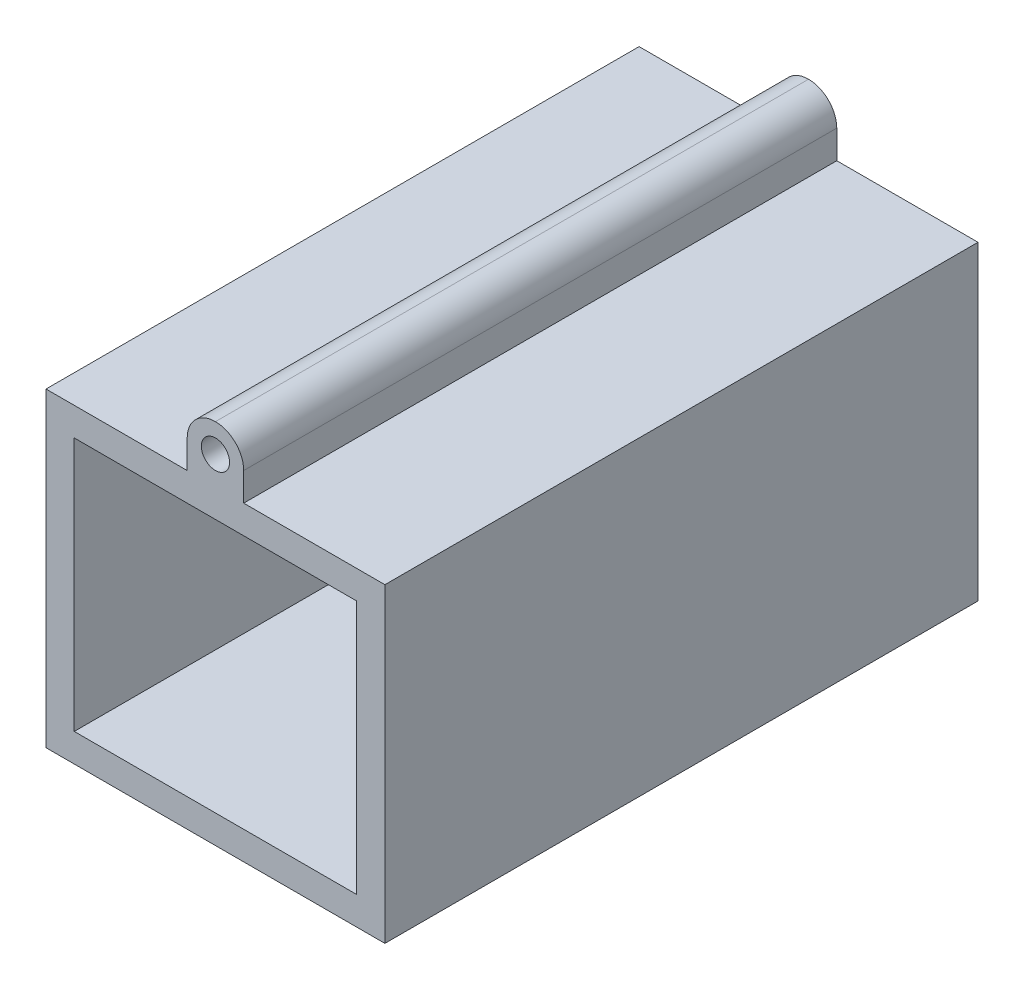
ISO-10303-21;
HEADER;
FILE_DESCRIPTION(('STEP AP214'),'2;1');
FILE_NAME('part.step','',(''),(''),'','','');
FILE_SCHEMA(('AUTOMOTIVE_DESIGN { 1 0 10303 214 1 1 1 1 }'));
ENDSEC;
DATA;
#1=APPLICATION_CONTEXT('core data for automotive mechanical design processes');
#2=APPLICATION_PROTOCOL_DEFINITION('international standard','automotive_design',2000,#1);
#3=PRODUCT_CONTEXT('',#1,'mechanical');
#4=PRODUCT('Part','Part','',(#3));
#5=PRODUCT_RELATED_PRODUCT_CATEGORY('part','',(#4));
#6=PRODUCT_DEFINITION_FORMATION('','',#4);
#7=PRODUCT_DEFINITION_CONTEXT('part definition',#1,'design');
#8=PRODUCT_DEFINITION('design','',#6,#7);
#9=PRODUCT_DEFINITION_SHAPE('','',#8);
#10=(LENGTH_UNIT() NAMED_UNIT(*) SI_UNIT(.MILLI.,.METRE.));
#11=(NAMED_UNIT(*) PLANE_ANGLE_UNIT() SI_UNIT($,.RADIAN.));
#12=(NAMED_UNIT(*) SI_UNIT($,.STERADIAN.) SOLID_ANGLE_UNIT());
#13=UNCERTAINTY_MEASURE_WITH_UNIT(LENGTH_MEASURE(1.E-05),#10,'distance_accuracy_value','');
#14=(GEOMETRIC_REPRESENTATION_CONTEXT(3) GLOBAL_UNCERTAINTY_ASSIGNED_CONTEXT((#13)) GLOBAL_UNIT_ASSIGNED_CONTEXT((#10,
#11,#12)) REPRESENTATION_CONTEXT('',''));
#15=CARTESIAN_POINT('',(0.,0.,0.));
#16=DIRECTION('',(0.,0.,1.));
#17=DIRECTION('',(1.,0.,0.));
#18=AXIS2_PLACEMENT_3D('',#15,#16,#17);
#19=CARTESIAN_POINT('',(30.,27.5,-105.));
#20=DIRECTION('',(0.,1.,0.));
#21=DIRECTION('',(0.,0.,1.));
#22=AXIS2_PLACEMENT_3D('',#19,#20,#21);
#23=PLANE('',#22);
#24=DIRECTION('',(0.,0.,1.));
#25=VECTOR('',#24,1.);
#26=CARTESIAN_POINT('',(-5.,27.5,0.));
#27=LINE('',#26,#25);
#28=CARTESIAN_POINT('',(-5.,27.5,-105.));
#29=VERTEX_POINT('',#28);
#30=CARTESIAN_POINT('',(-5.,27.5,0.));
#31=VERTEX_POINT('',#30);
#32=EDGE_CURVE('E163',#29,#31,#27,.T.);
#33=ORIENTED_EDGE('',*,*,#32,.F.);
#34=DIRECTION('',(-1.,0.,0.));
#35=VECTOR('',#34,1.);
#36=CARTESIAN_POINT('',(30.,27.5,-105.));
#37=LINE('',#36,#35);
#38=CARTESIAN_POINT('',(-30.,27.5,-105.));
#39=VERTEX_POINT('',#38);
#40=EDGE_CURVE('E160',#29,#39,#37,.T.);
#41=ORIENTED_EDGE('',*,*,#40,.T.);
#42=DIRECTION('',(0.,0.,1.));
#43=VECTOR('',#42,1.);
#44=CARTESIAN_POINT('',(-30.,27.5,-105.));
#45=LINE('',#44,#43);
#46=CARTESIAN_POINT('',(-30.,27.5,0.));
#47=VERTEX_POINT('',#46);
#48=EDGE_CURVE('E237',#39,#47,#45,.T.);
#49=ORIENTED_EDGE('',*,*,#48,.T.);
#50=DIRECTION('',(-1.,0.,0.));
#51=VECTOR('',#50,1.);
#52=CARTESIAN_POINT('',(30.,27.5,0.));
#53=LINE('',#52,#51);
#54=EDGE_CURVE('E235',#31,#47,#53,.T.);
#55=ORIENTED_EDGE('',*,*,#54,.F.);
#56=EDGE_LOOP('',(#33,#41,#49,#55));
#57=FACE_BOUND('',#56,.T.);
#58=ADVANCED_FACE('F33',(#57),#23,.T.);
#59=CARTESIAN_POINT('',(25.,-22.5,-105.));
#60=DIRECTION('',(1.,0.,0.));
#61=DIRECTION('',(0.,0.,-1.));
#62=AXIS2_PLACEMENT_3D('',#59,#60,#61);
#63=PLANE('',#62);
#64=DIRECTION('',(0.,-1.,0.));
#65=VECTOR('',#64,1.);
#66=CARTESIAN_POINT('',(25.,-12.5,-100.));
#67=LINE('',#66,#65);
#68=CARTESIAN_POINT('',(25.,-12.5,-100.));
#69=VERTEX_POINT('',#68);
#70=CARTESIAN_POINT('',(25.,-22.5,-100.));
#71=VERTEX_POINT('',#70);
#72=EDGE_CURVE('E183',#69,#71,#67,.T.);
#73=ORIENTED_EDGE('',*,*,#72,.T.);
#74=DIRECTION('',(0.,0.,1.));
#75=VECTOR('',#74,1.);
#76=CARTESIAN_POINT('',(25.,-22.5,-105.));
#77=LINE('',#76,#75);
#78=CARTESIAN_POINT('',(25.,-22.5,0.));
#79=VERTEX_POINT('',#78);
#80=EDGE_CURVE('E209',#71,#79,#77,.T.);
#81=ORIENTED_EDGE('',*,*,#80,.T.);
#82=DIRECTION('',(0.,1.,0.));
#83=VECTOR('',#82,1.);
#84=CARTESIAN_POINT('',(25.,-22.5,0.));
#85=LINE('',#84,#83);
#86=CARTESIAN_POINT('',(25.,22.5,0.));
#87=VERTEX_POINT('',#86);
#88=EDGE_CURVE('E189',#79,#87,#85,.T.);
#89=ORIENTED_EDGE('',*,*,#88,.T.);
#90=DIRECTION('',(0.,0.,1.));
#91=VECTOR('',#90,1.);
#92=CARTESIAN_POINT('',(25.,22.5,-105.));
#93=LINE('',#92,#91);
#94=CARTESIAN_POINT('',(25.,22.5,-105.));
#95=VERTEX_POINT('',#94);
#96=EDGE_CURVE('E199',#95,#87,#93,.T.);
#97=ORIENTED_EDGE('',*,*,#96,.F.);
#98=DIRECTION('',(0.,1.,0.));
#99=VECTOR('',#98,1.);
#100=CARTESIAN_POINT('',(25.,-22.5,-105.));
#101=LINE('',#100,#99);
#102=CARTESIAN_POINT('',(25.,-12.5,-105.));
#103=VERTEX_POINT('',#102);
#104=EDGE_CURVE('E190',#103,#95,#101,.T.);
#105=ORIENTED_EDGE('',*,*,#104,.F.);
#106=DIRECTION('',(0.,0.,-1.));
#107=VECTOR('',#106,1.);
#108=CARTESIAN_POINT('',(25.,-12.5,-105.));
#109=LINE('',#108,#107);
#110=EDGE_CURVE('E179',#69,#103,#109,.T.);
#111=ORIENTED_EDGE('',*,*,#110,.F.);
#112=EDGE_LOOP('',(#73,#81,#89,#97,#105,#111));
#113=FACE_BOUND('',#112,.T.);
#114=ADVANCED_FACE('F288',(#113),#63,.F.);
#115=CARTESIAN_POINT('',(25.,-22.5,-105.));
#116=DIRECTION('',(0.,-1.,0.));
#117=DIRECTION('',(1.,0.,0.));
#118=AXIS2_PLACEMENT_3D('',#115,#116,#117);
#119=PLANE('',#118);
#120=DIRECTION('',(1.,0.,0.));
#121=VECTOR('',#120,1.);
#122=CARTESIAN_POINT('',(-25.,-22.5,-100.));
#123=LINE('',#122,#121);
#124=CARTESIAN_POINT('',(-25.,-22.5,-100.));
#125=VERTEX_POINT('',#124);
#126=EDGE_CURVE('E173',#125,#71,#123,.T.);
#127=ORIENTED_EDGE('',*,*,#126,.F.);
#128=DIRECTION('',(0.,0.,1.));
#129=VECTOR('',#128,1.);
#130=CARTESIAN_POINT('',(-25.,-22.5,-105.));
#131=LINE('',#130,#129);
#132=CARTESIAN_POINT('',(-25.,-22.5,0.));
#133=VERTEX_POINT('',#132);
#134=EDGE_CURVE('E212',#125,#133,#131,.T.);
#135=ORIENTED_EDGE('',*,*,#134,.T.);
#136=DIRECTION('',(1.,0.,0.));
#137=VECTOR('',#136,1.);
#138=CARTESIAN_POINT('',(25.,-22.5,0.));
#139=LINE('',#138,#137);
#140=EDGE_CURVE('E193',#133,#79,#139,.T.);
#141=ORIENTED_EDGE('',*,*,#140,.T.);
#142=ORIENTED_EDGE('',*,*,#80,.F.);
#143=EDGE_LOOP('',(#127,#135,#141,#142));
#144=FACE_BOUND('',#143,.T.);
#145=ADVANCED_FACE('F293',(#144),#119,.F.);
#146=CARTESIAN_POINT('',(-25.,-22.5,-105.));
#147=DIRECTION('',(-1.,0.,0.));
#148=DIRECTION('',(0.,0.,1.));
#149=AXIS2_PLACEMENT_3D('',#146,#147,#148);
#150=PLANE('',#149);
#151=DIRECTION('',(0.,-1.,0.));
#152=VECTOR('',#151,1.);
#153=CARTESIAN_POINT('',(-25.,-12.5,-100.));
#154=LINE('',#153,#152);
#155=CARTESIAN_POINT('',(-25.,-12.5,-100.));
#156=VERTEX_POINT('',#155);
#157=EDGE_CURVE('E187',#156,#125,#154,.T.);
#158=ORIENTED_EDGE('',*,*,#157,.F.);
#159=DIRECTION('',(0.,0.,1.));
#160=VECTOR('',#159,1.);
#161=CARTESIAN_POINT('',(-25.,-12.5,-105.));
#162=LINE('',#161,#160);
#163=CARTESIAN_POINT('',(-25.,-12.5,-105.));
#164=VERTEX_POINT('',#163);
#165=EDGE_CURVE('E174',#164,#156,#162,.T.);
#166=ORIENTED_EDGE('',*,*,#165,.F.);
#167=DIRECTION('',(0.,-1.,0.));
#168=VECTOR('',#167,1.);
#169=CARTESIAN_POINT('',(-25.,-22.5,-105.));
#170=LINE('',#169,#168);
#171=CARTESIAN_POINT('',(-25.,22.5,-105.));
#172=VERTEX_POINT('',#171);
#173=EDGE_CURVE('E196',#172,#164,#170,.T.);
#174=ORIENTED_EDGE('',*,*,#173,.F.);
#175=DIRECTION('',(0.,0.,1.));
#176=VECTOR('',#175,1.);
#177=CARTESIAN_POINT('',(-25.,22.5,-105.));
#178=LINE('',#177,#176);
#179=CARTESIAN_POINT('',(-25.,22.5,0.));
#180=VERTEX_POINT('',#179);
#181=EDGE_CURVE('E214',#172,#180,#178,.T.);
#182=ORIENTED_EDGE('',*,*,#181,.T.);
#183=DIRECTION('',(0.,-1.,0.));
#184=VECTOR('',#183,1.);
#185=CARTESIAN_POINT('',(-25.,-22.5,0.));
#186=LINE('',#185,#184);
#187=EDGE_CURVE('E204',#180,#133,#186,.T.);
#188=ORIENTED_EDGE('',*,*,#187,.T.);
#189=ORIENTED_EDGE('',*,*,#134,.F.);
#190=EDGE_LOOP('',(#158,#166,#174,#182,#188,#189));
#191=FACE_BOUND('',#190,.T.);
#192=ADVANCED_FACE('F303',(#191),#150,.F.);
#193=CARTESIAN_POINT('',(-30.,-27.5,-105.));
#194=DIRECTION('',(-1.,0.,0.));
#195=DIRECTION('',(0.,0.,1.));
#196=AXIS2_PLACEMENT_3D('',#193,#194,#195);
#197=PLANE('',#196);
#198=DIRECTION('',(0.,-1.,0.));
#199=VECTOR('',#198,1.);
#200=CARTESIAN_POINT('',(-30.,-27.5,0.));
#201=LINE('',#200,#199);
#202=CARTESIAN_POINT('',(-30.,-27.5,0.));
#203=VERTEX_POINT('',#202);
#204=EDGE_CURVE('E211',#47,#203,#201,.T.);
#205=ORIENTED_EDGE('',*,*,#204,.F.);
#206=ORIENTED_EDGE('',*,*,#48,.F.);
#207=DIRECTION('',(0.,-1.,0.));
#208=VECTOR('',#207,1.);
#209=CARTESIAN_POINT('',(-30.,-27.5,-105.));
#210=LINE('',#209,#208);
#211=CARTESIAN_POINT('',(-30.,-27.5,-105.));
#212=VERTEX_POINT('',#211);
#213=EDGE_CURVE('E218',#39,#212,#210,.T.);
#214=ORIENTED_EDGE('',*,*,#213,.T.);
#215=DIRECTION('',(0.,0.,1.));
#216=VECTOR('',#215,1.);
#217=CARTESIAN_POINT('',(-30.,-27.5,-105.));
#218=LINE('',#217,#216);
#219=EDGE_CURVE('E159',#212,#203,#218,.T.);
#220=ORIENTED_EDGE('',*,*,#219,.T.);
#221=EDGE_LOOP('',(#205,#206,#214,#220));
#222=FACE_BOUND('',#221,.T.);
#223=ADVANCED_FACE('F262',(#222),#197,.T.);
#224=DIRECTION('',(0.,0.,-1.));
#225=VECTOR('',#224,1.);
#226=CARTESIAN_POINT('',(5.,27.5,0.));
#227=LINE('',#226,#225);
#228=CARTESIAN_POINT('',(5.,27.5,0.));
#229=VERTEX_POINT('',#228);
#230=CARTESIAN_POINT('',(5.,27.5,-105.));
#231=VERTEX_POINT('',#230);
#232=EDGE_CURVE('E155',#229,#231,#227,.T.);
#233=ORIENTED_EDGE('',*,*,#232,.F.);
#234=CARTESIAN_POINT('',(30.,27.5,0.));
#235=VERTEX_POINT('',#234);
#236=EDGE_CURVE('E222',#235,#229,#53,.T.);
#237=ORIENTED_EDGE('',*,*,#236,.F.);
#238=DIRECTION('',(0.,0.,1.));
#239=VECTOR('',#238,1.);
#240=CARTESIAN_POINT('',(30.,27.5,-105.));
#241=LINE('',#240,#239);
#242=CARTESIAN_POINT('',(30.,27.5,-105.));
#243=VERTEX_POINT('',#242);
#244=EDGE_CURVE('E157',#243,#235,#241,.T.);
#245=ORIENTED_EDGE('',*,*,#244,.F.);
#246=EDGE_CURVE('E141',#243,#231,#37,.T.);
#247=ORIENTED_EDGE('',*,*,#246,.T.);
#248=EDGE_LOOP('',(#233,#237,#245,#247));
#249=FACE_BOUND('',#248,.T.);
#250=ADVANCED_FACE('F153',(#249),#23,.T.);
#251=CARTESIAN_POINT('',(30.,-27.5,-105.));
#252=DIRECTION('',(1.,0.,0.));
#253=DIRECTION('',(0.,0.,-1.));
#254=AXIS2_PLACEMENT_3D('',#251,#252,#253);
#255=PLANE('',#254);
#256=DIRECTION('',(0.,1.,0.));
#257=VECTOR('',#256,1.);
#258=CARTESIAN_POINT('',(30.,-27.5,0.));
#259=LINE('',#258,#257);
#260=CARTESIAN_POINT('',(30.,-27.5,0.));
#261=VERTEX_POINT('',#260);
#262=EDGE_CURVE('E232',#261,#235,#259,.T.);
#263=ORIENTED_EDGE('',*,*,#262,.F.);
#264=DIRECTION('',(0.,0.,1.));
#265=VECTOR('',#264,1.);
#266=CARTESIAN_POINT('',(30.,-27.5,-105.));
#267=LINE('',#266,#265);
#268=CARTESIAN_POINT('',(30.,-27.5,-105.));
#269=VERTEX_POINT('',#268);
#270=EDGE_CURVE('E242',#269,#261,#267,.T.);
#271=ORIENTED_EDGE('',*,*,#270,.F.);
#272=DIRECTION('',(0.,1.,0.));
#273=VECTOR('',#272,1.);
#274=CARTESIAN_POINT('',(30.,-27.5,-105.));
#275=LINE('',#274,#273);
#276=EDGE_CURVE('E225',#269,#243,#275,.T.);
#277=ORIENTED_EDGE('',*,*,#276,.T.);
#278=ORIENTED_EDGE('',*,*,#244,.T.);
#279=EDGE_LOOP('',(#263,#271,#277,#278));
#280=FACE_BOUND('',#279,.T.);
#281=ADVANCED_FACE('F255',(#280),#255,.T.);
#282=CARTESIAN_POINT('',(30.,-27.5,-105.));
#283=DIRECTION('',(0.,-1.,0.));
#284=DIRECTION('',(1.,0.,0.));
#285=AXIS2_PLACEMENT_3D('',#282,#283,#284);
#286=PLANE('',#285);
#287=DIRECTION('',(1.,0.,0.));
#288=VECTOR('',#287,1.);
#289=CARTESIAN_POINT('',(30.,-27.5,0.));
#290=LINE('',#289,#288);
#291=EDGE_CURVE('E229',#203,#261,#290,.T.);
#292=ORIENTED_EDGE('',*,*,#291,.F.);
#293=ORIENTED_EDGE('',*,*,#219,.F.);
#294=DIRECTION('',(1.,0.,0.));
#295=VECTOR('',#294,1.);
#296=CARTESIAN_POINT('',(30.,-27.5,-105.));
#297=LINE('',#296,#295);
#298=EDGE_CURVE('E221',#212,#269,#297,.T.);
#299=ORIENTED_EDGE('',*,*,#298,.T.);
#300=ORIENTED_EDGE('',*,*,#270,.T.);
#301=EDGE_LOOP('',(#292,#293,#299,#300));
#302=FACE_BOUND('',#301,.T.);
#303=ADVANCED_FACE('F259',(#302),#286,.T.);
#304=CARTESIAN_POINT('',(0.,0.,-105.));
#305=DIRECTION('',(0.,0.,1.));
#306=DIRECTION('',(1.,0.,0.));
#307=AXIS2_PLACEMENT_3D('',#304,#305,#306);
#308=PLANE('',#307);
#309=CARTESIAN_POINT('',(0.,32.5,-105.));
#310=DIRECTION('',(0.,0.,1.));
#311=DIRECTION('',(1.,0.,0.));
#312=AXIS2_PLACEMENT_3D('',#309,#310,#311);
#313=CIRCLE('',#312,2.5);
#314=CARTESIAN_POINT('',(2.5,32.5,-105.));
#315=VERTEX_POINT('',#314);
#316=EDGE_CURVE('E276',#315,#315,#313,.T.);
#317=ORIENTED_EDGE('',*,*,#316,.T.);
#318=EDGE_LOOP('',(#317));
#319=FACE_BOUND('',#318,.T.);
#320=DIRECTION('',(-1.,0.,0.));
#321=VECTOR('',#320,1.);
#322=CARTESIAN_POINT('',(-25.,-12.5,-105.));
#323=LINE('',#322,#321);
#324=EDGE_CURVE('E181',#103,#164,#323,.T.);
#325=ORIENTED_EDGE('',*,*,#324,.F.);
#326=ORIENTED_EDGE('',*,*,#104,.T.);
#327=DIRECTION('',(-1.,0.,0.));
#328=VECTOR('',#327,1.);
#329=CARTESIAN_POINT('',(25.,22.5,-105.));
#330=LINE('',#329,#328);
#331=EDGE_CURVE('E192',#95,#172,#330,.T.);
#332=ORIENTED_EDGE('',*,*,#331,.T.);
#333=ORIENTED_EDGE('',*,*,#173,.T.);
#334=EDGE_LOOP('',(#325,#326,#332,#333));
#335=FACE_BOUND('',#334,.T.);
#336=CARTESIAN_POINT('',(0.,32.5,-105.));
#337=DIRECTION('',(0.,0.,1.));
#338=DIRECTION('',(1.,0.,0.));
#339=AXIS2_PLACEMENT_3D('',#336,#337,#338);
#340=CIRCLE('',#339,5.);
#341=CARTESIAN_POINT('',(-5.,32.5,-105.));
#342=VERTEX_POINT('',#341);
#343=CARTESIAN_POINT('',(0.,37.5,-105.));
#344=VERTEX_POINT('',#343);
#345=EDGE_CURVE('E240',#342,#344,#340,.F.);
#346=ORIENTED_EDGE('',*,*,#345,.T.);
#347=CARTESIAN_POINT('',(0.,32.5,-105.));
#348=DIRECTION('',(0.,0.,1.));
#349=DIRECTION('',(1.,0.,0.));
#350=AXIS2_PLACEMENT_3D('',#347,#348,#349);
#351=CIRCLE('',#350,5.);
#352=CARTESIAN_POINT('',(5.,32.5,-105.));
#353=VERTEX_POINT('',#352);
#354=EDGE_CURVE('E143',#344,#353,#351,.F.);
#355=ORIENTED_EDGE('',*,*,#354,.T.);
#356=DIRECTION('',(0.,-1.,0.));
#357=VECTOR('',#356,1.);
#358=CARTESIAN_POINT('',(5.,37.5,-105.));
#359=LINE('',#358,#357);
#360=EDGE_CURVE('E137',#353,#231,#359,.T.);
#361=ORIENTED_EDGE('',*,*,#360,.T.);
#362=ORIENTED_EDGE('',*,*,#246,.F.);
#363=ORIENTED_EDGE('',*,*,#276,.F.);
#364=ORIENTED_EDGE('',*,*,#298,.F.);
#365=ORIENTED_EDGE('',*,*,#213,.F.);
#366=ORIENTED_EDGE('',*,*,#40,.F.);
#367=DIRECTION('',(0.,-1.,0.));
#368=VECTOR('',#367,1.);
#369=CARTESIAN_POINT('',(-5.,37.5,-105.));
#370=LINE('',#369,#368);
#371=EDGE_CURVE('E149',#342,#29,#370,.T.);
#372=ORIENTED_EDGE('',*,*,#371,.F.);
#373=EDGE_LOOP('',(#346,#355,#361,#362,#363,#364,#365,#366,#372));
#374=FACE_BOUND('',#373,.T.);
#375=ADVANCED_FACE('F139',(#319,#335,#374),#308,.F.);
#376=CARTESIAN_POINT('',(0.,0.,0.));
#377=DIRECTION('',(0.,0.,1.));
#378=DIRECTION('',(1.,0.,0.));
#379=AXIS2_PLACEMENT_3D('',#376,#377,#378);
#380=PLANE('',#379);
#381=CARTESIAN_POINT('',(0.,32.5,0.));
#382=DIRECTION('',(0.,0.,1.));
#383=DIRECTION('',(1.,0.,0.));
#384=AXIS2_PLACEMENT_3D('',#381,#382,#383);
#385=CIRCLE('',#384,2.5);
#386=CARTESIAN_POINT('',(2.5,32.5,0.));
#387=VERTEX_POINT('',#386);
#388=EDGE_CURVE('E464',#387,#387,#385,.T.);
#389=ORIENTED_EDGE('',*,*,#388,.F.);
#390=EDGE_LOOP('',(#389));
#391=FACE_BOUND('',#390,.T.);
#392=ORIENTED_EDGE('',*,*,#88,.F.);
#393=ORIENTED_EDGE('',*,*,#140,.F.);
#394=ORIENTED_EDGE('',*,*,#187,.F.);
#395=DIRECTION('',(-1.,0.,0.));
#396=VECTOR('',#395,1.);
#397=CARTESIAN_POINT('',(25.,22.5,0.));
#398=LINE('',#397,#396);
#399=EDGE_CURVE('E201',#87,#180,#398,.T.);
#400=ORIENTED_EDGE('',*,*,#399,.F.);
#401=EDGE_LOOP('',(#392,#393,#394,#400));
#402=FACE_BOUND('',#401,.T.);
#403=DIRECTION('',(0.,-1.,0.));
#404=VECTOR('',#403,1.);
#405=CARTESIAN_POINT('',(5.,37.5,0.));
#406=LINE('',#405,#404);
#407=CARTESIAN_POINT('',(5.,32.5,0.));
#408=VERTEX_POINT('',#407);
#409=EDGE_CURVE('E148',#408,#229,#406,.T.);
#410=ORIENTED_EDGE('',*,*,#409,.F.);
#411=CARTESIAN_POINT('',(0.,32.5,0.));
#412=DIRECTION('',(0.,0.,1.));
#413=DIRECTION('',(1.,0.,0.));
#414=AXIS2_PLACEMENT_3D('',#411,#412,#413);
#415=CIRCLE('',#414,5.);
#416=CARTESIAN_POINT('',(0.,37.5,0.));
#417=VERTEX_POINT('',#416);
#418=EDGE_CURVE('E42',#408,#417,#415,.T.);
#419=ORIENTED_EDGE('',*,*,#418,.T.);
#420=CARTESIAN_POINT('',(0.,32.5,0.));
#421=DIRECTION('',(0.,0.,1.));
#422=DIRECTION('',(1.,0.,0.));
#423=AXIS2_PLACEMENT_3D('',#420,#421,#422);
#424=CIRCLE('',#423,5.);
#425=CARTESIAN_POINT('',(-5.,32.5,0.));
#426=VERTEX_POINT('',#425);
#427=EDGE_CURVE('E49',#417,#426,#424,.T.);
#428=ORIENTED_EDGE('',*,*,#427,.T.);
#429=DIRECTION('',(0.,-1.,0.));
#430=VECTOR('',#429,1.);
#431=CARTESIAN_POINT('',(-5.,37.5,0.));
#432=LINE('',#431,#430);
#433=EDGE_CURVE('E171',#426,#31,#432,.T.);
#434=ORIENTED_EDGE('',*,*,#433,.T.);
#435=ORIENTED_EDGE('',*,*,#54,.T.);
#436=ORIENTED_EDGE('',*,*,#204,.T.);
#437=ORIENTED_EDGE('',*,*,#291,.T.);
#438=ORIENTED_EDGE('',*,*,#262,.T.);
#439=ORIENTED_EDGE('',*,*,#236,.T.);
#440=EDGE_LOOP('',(#410,#419,#428,#434,#435,#436,#437,#438,#439));
#441=FACE_BOUND('',#440,.T.);
#442=ADVANCED_FACE('F251',(#391,#402,#441),#380,.T.);
#443=CARTESIAN_POINT('',(25.,22.5,-105.));
#444=DIRECTION('',(0.,1.,0.));
#445=DIRECTION('',(-1.,0.,0.));
#446=AXIS2_PLACEMENT_3D('',#443,#444,#445);
#447=PLANE('',#446);
#448=ORIENTED_EDGE('',*,*,#399,.T.);
#449=ORIENTED_EDGE('',*,*,#181,.F.);
#450=ORIENTED_EDGE('',*,*,#331,.F.);
#451=ORIENTED_EDGE('',*,*,#96,.T.);
#452=EDGE_LOOP('',(#448,#449,#450,#451));
#453=FACE_BOUND('',#452,.T.);
#454=ADVANCED_FACE('F319',(#453),#447,.F.);
#455=CARTESIAN_POINT('',(-25.,-12.5,-100.));
#456=DIRECTION('',(0.,0.,-1.));
#457=DIRECTION('',(-1.,0.,0.));
#458=AXIS2_PLACEMENT_3D('',#455,#456,#457);
#459=PLANE('',#458);
#460=ORIENTED_EDGE('',*,*,#126,.T.);
#461=ORIENTED_EDGE('',*,*,#72,.F.);
#462=DIRECTION('',(1.,0.,0.));
#463=VECTOR('',#462,1.);
#464=CARTESIAN_POINT('',(-25.,-12.5,-100.));
#465=LINE('',#464,#463);
#466=EDGE_CURVE('E177',#156,#69,#465,.T.);
#467=ORIENTED_EDGE('',*,*,#466,.F.);
#468=ORIENTED_EDGE('',*,*,#157,.T.);
#469=EDGE_LOOP('',(#460,#461,#467,#468));
#470=FACE_BOUND('',#469,.T.);
#471=ADVANCED_FACE('F325',(#470),#459,.F.);
#472=CARTESIAN_POINT('',(0.,-12.5,0.));
#473=DIRECTION('',(0.,1.,0.));
#474=DIRECTION('',(-1.,0.,0.));
#475=AXIS2_PLACEMENT_3D('',#472,#473,#474);
#476=PLANE('',#475);
#477=ORIENTED_EDGE('',*,*,#165,.T.);
#478=ORIENTED_EDGE('',*,*,#466,.T.);
#479=ORIENTED_EDGE('',*,*,#110,.T.);
#480=ORIENTED_EDGE('',*,*,#324,.T.);
#481=EDGE_LOOP('',(#477,#478,#479,#480));
#482=FACE_BOUND('',#481,.T.);
#483=ADVANCED_FACE('F333',(#482),#476,.T.);
#484=CARTESIAN_POINT('',(-5.,37.5,0.));
#485=DIRECTION('',(1.,0.,0.));
#486=DIRECTION('',(0.,0.,-1.));
#487=AXIS2_PLACEMENT_3D('',#484,#485,#486);
#488=PLANE('',#487);
#489=ORIENTED_EDGE('',*,*,#433,.F.);
#490=DIRECTION('',(0.,0.,1.));
#491=VECTOR('',#490,1.);
#492=CARTESIAN_POINT('',(-5.,32.5,-105.));
#493=LINE('',#492,#491);
#494=EDGE_CURVE('E11',#426,#342,#493,.F.);
#495=ORIENTED_EDGE('',*,*,#494,.T.);
#496=ORIENTED_EDGE('',*,*,#371,.T.);
#497=ORIENTED_EDGE('',*,*,#32,.T.);
#498=EDGE_LOOP('',(#489,#495,#496,#497));
#499=FACE_BOUND('',#498,.T.);
#500=ADVANCED_FACE('F271',(#499),#488,.F.);
#501=CARTESIAN_POINT('',(5.,37.5,0.));
#502=DIRECTION('',(-1.,0.,0.));
#503=DIRECTION('',(0.,0.,1.));
#504=AXIS2_PLACEMENT_3D('',#501,#502,#503);
#505=PLANE('',#504);
#506=ORIENTED_EDGE('',*,*,#360,.F.);
#507=DIRECTION('',(0.,0.,-1.));
#508=VECTOR('',#507,1.);
#509=CARTESIAN_POINT('',(5.,32.5,0.));
#510=LINE('',#509,#508);
#511=EDGE_CURVE('E247',#353,#408,#510,.F.);
#512=ORIENTED_EDGE('',*,*,#511,.T.);
#513=ORIENTED_EDGE('',*,*,#409,.T.);
#514=ORIENTED_EDGE('',*,*,#232,.T.);
#515=EDGE_LOOP('',(#506,#512,#513,#514));
#516=FACE_BOUND('',#515,.T.);
#517=ADVANCED_FACE('F162',(#516),#505,.F.);
#518=CARTESIAN_POINT('',(0.,32.5,0.));
#519=DIRECTION('',(0.,0.,-1.));
#520=DIRECTION('',(-1.,0.,0.));
#521=AXIS2_PLACEMENT_3D('',#518,#519,#520);
#522=CYLINDRICAL_SURFACE('',#521,5.);
#523=ORIENTED_EDGE('',*,*,#494,.F.);
#524=ORIENTED_EDGE('',*,*,#427,.F.);
#525=DIRECTION('',(0.,0.,1.));
#526=VECTOR('',#525,1.);
#527=CARTESIAN_POINT('',(0.,37.5,0.));
#528=LINE('',#527,#526);
#529=EDGE_CURVE('E37',#344,#417,#528,.T.);
#530=ORIENTED_EDGE('',*,*,#529,.F.);
#531=ORIENTED_EDGE('',*,*,#345,.F.);
#532=EDGE_LOOP('',(#523,#524,#530,#531));
#533=FACE_BOUND('',#532,.T.);
#534=ADVANCED_FACE('F35',(#533),#522,.T.);
#535=CARTESIAN_POINT('',(0.,32.5,0.));
#536=DIRECTION('',(0.,0.,1.));
#537=DIRECTION('',(1.,0.,0.));
#538=AXIS2_PLACEMENT_3D('',#535,#536,#537);
#539=CYLINDRICAL_SURFACE('',#538,5.);
#540=ORIENTED_EDGE('',*,*,#418,.F.);
#541=ORIENTED_EDGE('',*,*,#511,.F.);
#542=ORIENTED_EDGE('',*,*,#354,.F.);
#543=ORIENTED_EDGE('',*,*,#529,.T.);
#544=EDGE_LOOP('',(#540,#541,#542,#543));
#545=FACE_BOUND('',#544,.T.);
#546=ADVANCED_FACE('F277',(#545),#539,.T.);
#547=CARTESIAN_POINT('',(0.,32.5,-105.));
#548=DIRECTION('',(0.,0.,1.));
#549=DIRECTION('',(1.,0.,0.));
#550=AXIS2_PLACEMENT_3D('',#547,#548,#549);
#551=CYLINDRICAL_SURFACE('',#550,2.5);
#552=ORIENTED_EDGE('',*,*,#316,.F.);
#553=EDGE_LOOP('',(#552));
#554=FACE_BOUND('',#553,.T.);
#555=ORIENTED_EDGE('',*,*,#388,.T.);
#556=EDGE_LOOP('',(#555));
#557=FACE_BOUND('',#556,.T.);
#558=ADVANCED_FACE('F279',(#554,#557),#551,.F.);
#559=CLOSED_SHELL('',(#58,#114,#145,#192,#223,#250,#281,#303,#375,#442,#454,#471,#483,#500,#517,
#534,#546,#558));
#560=MANIFOLD_SOLID_BREP('B2',#559);
#561=ADVANCED_BREP_SHAPE_REPRESENTATION('',(#18,#560),#14);
#562=SHAPE_DEFINITION_REPRESENTATION(#9,#561);
ENDSEC;
END-ISO-10303-21;
